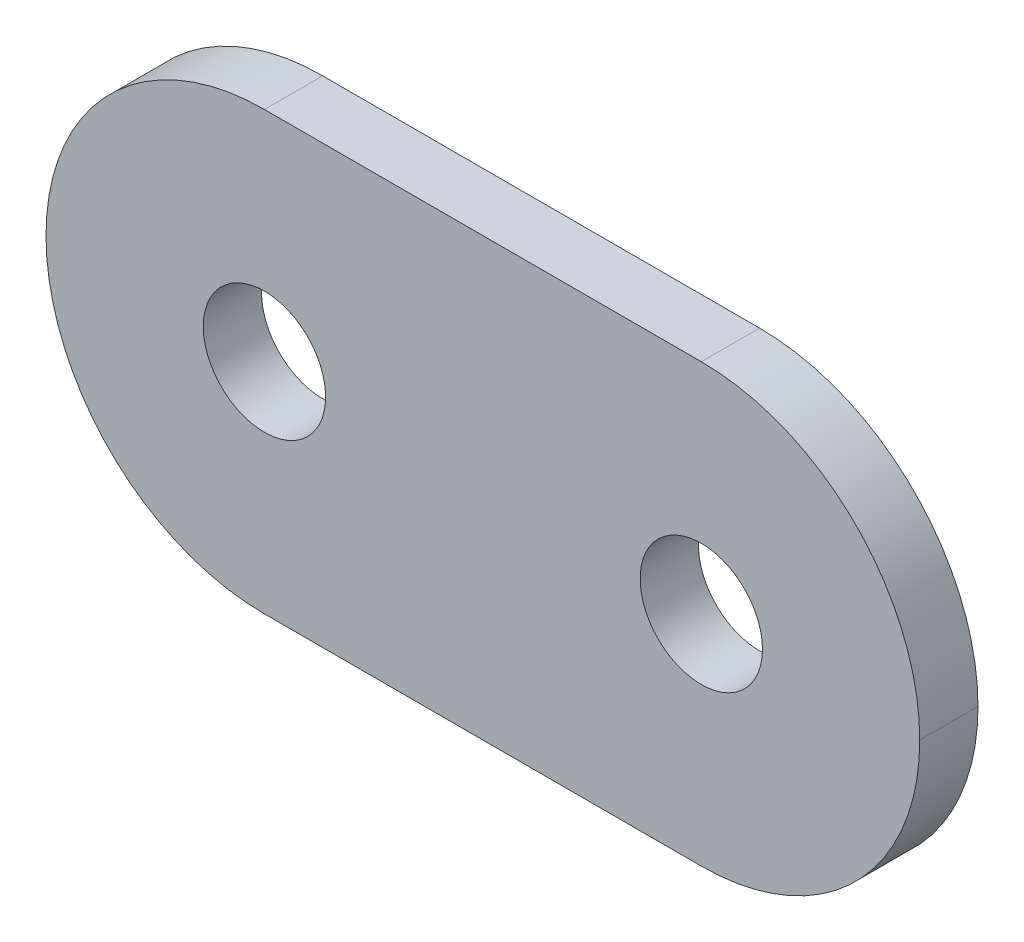
ISO-10303-21;
HEADER;
FILE_DESCRIPTION(('STEP AP214'),'2;1');
FILE_NAME('part.step','',(''),(''),'','','');
FILE_SCHEMA(('AUTOMOTIVE_DESIGN { 1 0 10303 214 1 1 1 1 }'));
ENDSEC;
DATA;
#1=APPLICATION_CONTEXT('core data for automotive mechanical design processes');
#2=APPLICATION_PROTOCOL_DEFINITION('international standard','automotive_design',2000,#1);
#3=PRODUCT_CONTEXT('',#1,'mechanical');
#4=PRODUCT('Part','Part','',(#3));
#5=PRODUCT_RELATED_PRODUCT_CATEGORY('part','',(#4));
#6=PRODUCT_DEFINITION_FORMATION('','',#4);
#7=PRODUCT_DEFINITION_CONTEXT('part definition',#1,'design');
#8=PRODUCT_DEFINITION('design','',#6,#7);
#9=PRODUCT_DEFINITION_SHAPE('','',#8);
#10=(LENGTH_UNIT() NAMED_UNIT(*) SI_UNIT(.MILLI.,.METRE.));
#11=(NAMED_UNIT(*) PLANE_ANGLE_UNIT() SI_UNIT($,.RADIAN.));
#12=(NAMED_UNIT(*) SI_UNIT($,.STERADIAN.) SOLID_ANGLE_UNIT());
#13=UNCERTAINTY_MEASURE_WITH_UNIT(LENGTH_MEASURE(1.E-05),#10,'distance_accuracy_value','');
#14=(GEOMETRIC_REPRESENTATION_CONTEXT(3) GLOBAL_UNCERTAINTY_ASSIGNED_CONTEXT((#13)) GLOBAL_UNIT_ASSIGNED_CONTEXT((#10,
#11,#12)) REPRESENTATION_CONTEXT('',''));
#15=CARTESIAN_POINT('',(0.,0.,0.));
#16=DIRECTION('',(0.,0.,1.));
#17=DIRECTION('',(1.,0.,0.));
#18=AXIS2_PLACEMENT_3D('',#15,#16,#17);
#19=CARTESIAN_POINT('',(-15.,7.5,-2.));
#20=DIRECTION('',(0.,-1.,0.));
#21=DIRECTION('',(0.,0.,1.));
#22=AXIS2_PLACEMENT_3D('',#19,#20,#21);
#23=PLANE('',#22);
#24=DIRECTION('',(-1.,0.,0.));
#25=VECTOR('',#24,1.);
#26=CARTESIAN_POINT('',(-15.,7.5,0.));
#27=LINE('',#26,#25);
#28=CARTESIAN_POINT('',(7.5,7.5,0.));
#29=VERTEX_POINT('',#28);
#30=CARTESIAN_POINT('',(-7.5,7.5,0.));
#31=VERTEX_POINT('',#30);
#32=EDGE_CURVE('E100',#29,#31,#27,.T.);
#33=ORIENTED_EDGE('',*,*,#32,.F.);
#34=DIRECTION('',(0.,0.,1.));
#35=VECTOR('',#34,1.);
#36=CARTESIAN_POINT('',(7.5,7.5,-2.));
#37=LINE('',#36,#35);
#38=CARTESIAN_POINT('',(7.5,7.5,-2.));
#39=VERTEX_POINT('',#38);
#40=EDGE_CURVE('E46',#39,#29,#37,.T.);
#41=ORIENTED_EDGE('',*,*,#40,.F.);
#42=DIRECTION('',(-1.,0.,0.));
#43=VECTOR('',#42,1.);
#44=CARTESIAN_POINT('',(-15.,7.5,-2.));
#45=LINE('',#44,#43);
#46=CARTESIAN_POINT('',(-7.5,7.5,-2.));
#47=VERTEX_POINT('',#46);
#48=EDGE_CURVE('E138',#39,#47,#45,.T.);
#49=ORIENTED_EDGE('',*,*,#48,.T.);
#50=DIRECTION('',(0.,0.,1.));
#51=VECTOR('',#50,1.);
#52=CARTESIAN_POINT('',(-7.5,7.5,-2.));
#53=LINE('',#52,#51);
#54=EDGE_CURVE('E11',#31,#47,#53,.F.);
#55=ORIENTED_EDGE('',*,*,#54,.F.);
#56=EDGE_LOOP('',(#33,#41,#49,#55));
#57=FACE_BOUND('',#56,.T.);
#58=ADVANCED_FACE('F37',(#57),#23,.F.);
#59=CARTESIAN_POINT('',(-15.,-7.5,-2.));
#60=DIRECTION('',(0.,1.,0.));
#61=DIRECTION('',(0.,0.,-1.));
#62=AXIS2_PLACEMENT_3D('',#59,#60,#61);
#63=PLANE('',#62);
#64=DIRECTION('',(1.,0.,0.));
#65=VECTOR('',#64,1.);
#66=CARTESIAN_POINT('',(-15.,-7.5,0.));
#67=LINE('',#66,#65);
#68=CARTESIAN_POINT('',(-7.5,-7.5,0.));
#69=VERTEX_POINT('',#68);
#70=CARTESIAN_POINT('',(7.5,-7.5,0.));
#71=VERTEX_POINT('',#70);
#72=EDGE_CURVE('E113',#69,#71,#67,.T.);
#73=ORIENTED_EDGE('',*,*,#72,.F.);
#74=DIRECTION('',(0.,0.,1.));
#75=VECTOR('',#74,1.);
#76=CARTESIAN_POINT('',(-7.5,-7.5,-2.));
#77=LINE('',#76,#75);
#78=CARTESIAN_POINT('',(-7.5,-7.5,-2.));
#79=VERTEX_POINT('',#78);
#80=EDGE_CURVE('E121',#79,#69,#77,.T.);
#81=ORIENTED_EDGE('',*,*,#80,.F.);
#82=DIRECTION('',(1.,0.,0.));
#83=VECTOR('',#82,1.);
#84=CARTESIAN_POINT('',(-15.,-7.5,-2.));
#85=LINE('',#84,#83);
#86=CARTESIAN_POINT('',(7.5,-7.5,-2.));
#87=VERTEX_POINT('',#86);
#88=EDGE_CURVE('E108',#79,#87,#85,.T.);
#89=ORIENTED_EDGE('',*,*,#88,.T.);
#90=DIRECTION('',(0.,0.,1.));
#91=VECTOR('',#90,1.);
#92=CARTESIAN_POINT('',(7.5,-7.5,-2.));
#93=LINE('',#92,#91);
#94=EDGE_CURVE('E124',#71,#87,#93,.F.);
#95=ORIENTED_EDGE('',*,*,#94,.F.);
#96=EDGE_LOOP('',(#73,#81,#89,#95));
#97=FACE_BOUND('',#96,.T.);
#98=ADVANCED_FACE('F140',(#97),#63,.F.);
#99=CARTESIAN_POINT('',(0.,0.,-2.));
#100=DIRECTION('',(0.,0.,1.));
#101=DIRECTION('',(-1.,0.,0.));
#102=AXIS2_PLACEMENT_3D('',#99,#100,#101);
#103=PLANE('',#102);
#104=CARTESIAN_POINT('',(-7.5,0.,-2.));
#105=DIRECTION('',(0.,0.,1.));
#106=DIRECTION('',(-1.,0.,0.));
#107=AXIS2_PLACEMENT_3D('',#104,#105,#106);
#108=CIRCLE('',#107,2.1);
#109=CARTESIAN_POINT('',(-9.6,0.,-2.));
#110=VERTEX_POINT('',#109);
#111=EDGE_CURVE('E152',#110,#110,#108,.T.);
#112=ORIENTED_EDGE('',*,*,#111,.T.);
#113=EDGE_LOOP('',(#112));
#114=FACE_BOUND('',#113,.T.);
#115=CARTESIAN_POINT('',(7.5,0.,-2.));
#116=DIRECTION('',(0.,0.,1.));
#117=DIRECTION('',(1.,0.,0.));
#118=AXIS2_PLACEMENT_3D('',#115,#116,#117);
#119=CIRCLE('',#118,2.1);
#120=CARTESIAN_POINT('',(9.6,0.,-2.));
#121=VERTEX_POINT('',#120);
#122=EDGE_CURVE('E145',#121,#121,#119,.T.);
#123=ORIENTED_EDGE('',*,*,#122,.T.);
#124=EDGE_LOOP('',(#123));
#125=FACE_BOUND('',#124,.T.);
#126=CARTESIAN_POINT('',(-7.5,0.,-2.));
#127=DIRECTION('',(0.,0.,-1.));
#128=DIRECTION('',(-1.,0.,0.));
#129=AXIS2_PLACEMENT_3D('',#126,#127,#128);
#130=CIRCLE('',#129,7.5);
#131=CARTESIAN_POINT('',(-15.,0.,-2.));
#132=VERTEX_POINT('',#131);
#133=EDGE_CURVE('E60',#47,#132,#130,.F.);
#134=ORIENTED_EDGE('',*,*,#133,.F.);
#135=ORIENTED_EDGE('',*,*,#48,.F.);
#136=CARTESIAN_POINT('',(7.5,0.,-2.));
#137=DIRECTION('',(0.,0.,-1.));
#138=DIRECTION('',(-1.,0.,0.));
#139=AXIS2_PLACEMENT_3D('',#136,#137,#138);
#140=CIRCLE('',#139,7.5);
#141=CARTESIAN_POINT('',(15.,0.,-2.));
#142=VERTEX_POINT('',#141);
#143=EDGE_CURVE('E126',#142,#39,#140,.F.);
#144=ORIENTED_EDGE('',*,*,#143,.F.);
#145=CARTESIAN_POINT('',(7.5,0.,-2.));
#146=DIRECTION('',(0.,0.,-1.));
#147=DIRECTION('',(-1.,0.,0.));
#148=AXIS2_PLACEMENT_3D('',#145,#146,#147);
#149=CIRCLE('',#148,7.5);
#150=EDGE_CURVE('E97',#87,#142,#149,.F.);
#151=ORIENTED_EDGE('',*,*,#150,.F.);
#152=ORIENTED_EDGE('',*,*,#88,.F.);
#153=CARTESIAN_POINT('',(-7.5,0.,-2.));
#154=DIRECTION('',(0.,0.,-1.));
#155=DIRECTION('',(-1.,0.,0.));
#156=AXIS2_PLACEMENT_3D('',#153,#154,#155);
#157=CIRCLE('',#156,7.5);
#158=EDGE_CURVE('E130',#132,#79,#157,.F.);
#159=ORIENTED_EDGE('',*,*,#158,.F.);
#160=EDGE_LOOP('',(#134,#135,#144,#151,#152,#159));
#161=FACE_BOUND('',#160,.T.);
#162=ADVANCED_FACE('F136',(#114,#125,#161),#103,.F.);
#163=CARTESIAN_POINT('',(0.,0.,0.));
#164=DIRECTION('',(0.,0.,1.));
#165=DIRECTION('',(-1.,0.,0.));
#166=AXIS2_PLACEMENT_3D('',#163,#164,#165);
#167=PLANE('',#166);
#168=CARTESIAN_POINT('',(-7.5,0.,0.));
#169=DIRECTION('',(0.,0.,1.));
#170=DIRECTION('',(-1.,0.,0.));
#171=AXIS2_PLACEMENT_3D('',#168,#169,#170);
#172=CIRCLE('',#171,2.1);
#173=CARTESIAN_POINT('',(-9.6,0.,0.));
#174=VERTEX_POINT('',#173);
#175=EDGE_CURVE('E149',#174,#174,#172,.T.);
#176=ORIENTED_EDGE('',*,*,#175,.F.);
#177=EDGE_LOOP('',(#176));
#178=FACE_BOUND('',#177,.T.);
#179=CARTESIAN_POINT('',(7.5,0.,0.));
#180=DIRECTION('',(0.,0.,1.));
#181=DIRECTION('',(1.,0.,0.));
#182=AXIS2_PLACEMENT_3D('',#179,#180,#181);
#183=CIRCLE('',#182,2.1);
#184=CARTESIAN_POINT('',(9.6,0.,0.));
#185=VERTEX_POINT('',#184);
#186=EDGE_CURVE('E148',#185,#185,#183,.T.);
#187=ORIENTED_EDGE('',*,*,#186,.F.);
#188=EDGE_LOOP('',(#187));
#189=FACE_BOUND('',#188,.T.);
#190=ORIENTED_EDGE('',*,*,#72,.T.);
#191=CARTESIAN_POINT('',(7.5,0.,0.));
#192=DIRECTION('',(0.,0.,-1.));
#193=DIRECTION('',(-1.,0.,0.));
#194=AXIS2_PLACEMENT_3D('',#191,#192,#193);
#195=CIRCLE('',#194,7.5);
#196=CARTESIAN_POINT('',(15.,0.,0.));
#197=VERTEX_POINT('',#196);
#198=EDGE_CURVE('E95',#197,#71,#195,.T.);
#199=ORIENTED_EDGE('',*,*,#198,.F.);
#200=CARTESIAN_POINT('',(7.5,0.,0.));
#201=DIRECTION('',(0.,0.,-1.));
#202=DIRECTION('',(-1.,0.,0.));
#203=AXIS2_PLACEMENT_3D('',#200,#201,#202);
#204=CIRCLE('',#203,7.5);
#205=EDGE_CURVE('E102',#29,#197,#204,.T.);
#206=ORIENTED_EDGE('',*,*,#205,.F.);
#207=ORIENTED_EDGE('',*,*,#32,.T.);
#208=CARTESIAN_POINT('',(-7.5,0.,0.));
#209=DIRECTION('',(0.,0.,-1.));
#210=DIRECTION('',(-1.,0.,0.));
#211=AXIS2_PLACEMENT_3D('',#208,#209,#210);
#212=CIRCLE('',#211,7.5);
#213=CARTESIAN_POINT('',(-15.,0.,0.));
#214=VERTEX_POINT('',#213);
#215=EDGE_CURVE('E114',#214,#31,#212,.T.);
#216=ORIENTED_EDGE('',*,*,#215,.F.);
#217=CARTESIAN_POINT('',(-7.5,0.,0.));
#218=DIRECTION('',(0.,0.,-1.));
#219=DIRECTION('',(-1.,0.,0.));
#220=AXIS2_PLACEMENT_3D('',#217,#218,#219);
#221=CIRCLE('',#220,7.5);
#222=EDGE_CURVE('E116',#69,#214,#221,.T.);
#223=ORIENTED_EDGE('',*,*,#222,.F.);
#224=EDGE_LOOP('',(#190,#199,#206,#207,#216,#223));
#225=FACE_BOUND('',#224,.T.);
#226=ADVANCED_FACE('F111',(#178,#189,#225),#167,.T.);
#227=CARTESIAN_POINT('',(7.5,0.,-2.));
#228=DIRECTION('',(0.,0.,1.));
#229=DIRECTION('',(-1.,0.,0.));
#230=AXIS2_PLACEMENT_3D('',#227,#228,#229);
#231=CYLINDRICAL_SURFACE('',#230,7.5);
#232=ORIENTED_EDGE('',*,*,#40,.T.);
#233=ORIENTED_EDGE('',*,*,#205,.T.);
#234=DIRECTION('',(0.,0.,1.));
#235=VECTOR('',#234,1.);
#236=CARTESIAN_POINT('',(15.,0.,-2.));
#237=LINE('',#236,#235);
#238=EDGE_CURVE('E90',#197,#142,#237,.F.);
#239=ORIENTED_EDGE('',*,*,#238,.T.);
#240=ORIENTED_EDGE('',*,*,#143,.T.);
#241=EDGE_LOOP('',(#232,#233,#239,#240));
#242=FACE_BOUND('',#241,.T.);
#243=ADVANCED_FACE('F103',(#242),#231,.T.);
#244=CARTESIAN_POINT('',(7.5,0.,-2.));
#245=DIRECTION('',(0.,0.,1.));
#246=DIRECTION('',(-1.,0.,0.));
#247=AXIS2_PLACEMENT_3D('',#244,#245,#246);
#248=CYLINDRICAL_SURFACE('',#247,7.5);
#249=ORIENTED_EDGE('',*,*,#150,.T.);
#250=ORIENTED_EDGE('',*,*,#238,.F.);
#251=ORIENTED_EDGE('',*,*,#198,.T.);
#252=ORIENTED_EDGE('',*,*,#94,.T.);
#253=EDGE_LOOP('',(#249,#250,#251,#252));
#254=FACE_BOUND('',#253,.T.);
#255=ADVANCED_FACE('F92',(#254),#248,.T.);
#256=CARTESIAN_POINT('',(-7.5,0.,-2.));
#257=DIRECTION('',(0.,0.,1.));
#258=DIRECTION('',(-1.,0.,0.));
#259=AXIS2_PLACEMENT_3D('',#256,#257,#258);
#260=CYLINDRICAL_SURFACE('',#259,7.5);
#261=DIRECTION('',(0.,0.,1.));
#262=VECTOR('',#261,1.);
#263=CARTESIAN_POINT('',(-15.,0.,-2.));
#264=LINE('',#263,#262);
#265=EDGE_CURVE('E41',#132,#214,#264,.T.);
#266=ORIENTED_EDGE('',*,*,#265,.T.);
#267=ORIENTED_EDGE('',*,*,#215,.T.);
#268=ORIENTED_EDGE('',*,*,#54,.T.);
#269=ORIENTED_EDGE('',*,*,#133,.T.);
#270=EDGE_LOOP('',(#266,#267,#268,#269));
#271=FACE_BOUND('',#270,.T.);
#272=ADVANCED_FACE('F39',(#271),#260,.T.);
#273=CARTESIAN_POINT('',(-7.5,0.,-2.));
#274=DIRECTION('',(0.,0.,1.));
#275=DIRECTION('',(-1.,0.,0.));
#276=AXIS2_PLACEMENT_3D('',#273,#274,#275);
#277=CYLINDRICAL_SURFACE('',#276,7.5);
#278=ORIENTED_EDGE('',*,*,#158,.T.);
#279=ORIENTED_EDGE('',*,*,#80,.T.);
#280=ORIENTED_EDGE('',*,*,#222,.T.);
#281=ORIENTED_EDGE('',*,*,#265,.F.);
#282=EDGE_LOOP('',(#278,#279,#280,#281));
#283=FACE_BOUND('',#282,.T.);
#284=ADVANCED_FACE('F133',(#283),#277,.T.);
#285=CARTESIAN_POINT('',(7.5,0.,0.));
#286=DIRECTION('',(0.,0.,-1.));
#287=DIRECTION('',(1.,0.,0.));
#288=AXIS2_PLACEMENT_3D('',#285,#286,#287);
#289=CYLINDRICAL_SURFACE('',#288,2.1);
#290=ORIENTED_EDGE('',*,*,#186,.T.);
#291=EDGE_LOOP('',(#290));
#292=FACE_BOUND('',#291,.T.);
#293=ORIENTED_EDGE('',*,*,#122,.F.);
#294=EDGE_LOOP('',(#293));
#295=FACE_BOUND('',#294,.T.);
#296=ADVANCED_FACE('F166',(#292,#295),#289,.F.);
#297=CARTESIAN_POINT('',(-7.5,0.,0.));
#298=DIRECTION('',(0.,0.,-1.));
#299=DIRECTION('',(1.,0.,0.));
#300=AXIS2_PLACEMENT_3D('',#297,#298,#299);
#301=CYLINDRICAL_SURFACE('',#300,2.1);
#302=ORIENTED_EDGE('',*,*,#175,.T.);
#303=EDGE_LOOP('',(#302));
#304=FACE_BOUND('',#303,.T.);
#305=ORIENTED_EDGE('',*,*,#111,.F.);
#306=EDGE_LOOP('',(#305));
#307=FACE_BOUND('',#306,.T.);
#308=ADVANCED_FACE('F158',(#304,#307),#301,.F.);
#309=CLOSED_SHELL('',(#58,#98,#162,#226,#243,#255,#272,#284,#296,#308));
#310=MANIFOLD_SOLID_BREP('B2',#309);
#311=ADVANCED_BREP_SHAPE_REPRESENTATION('',(#18,#310),#14);
#312=SHAPE_DEFINITION_REPRESENTATION(#9,#311);
ENDSEC;
END-ISO-10303-21;
